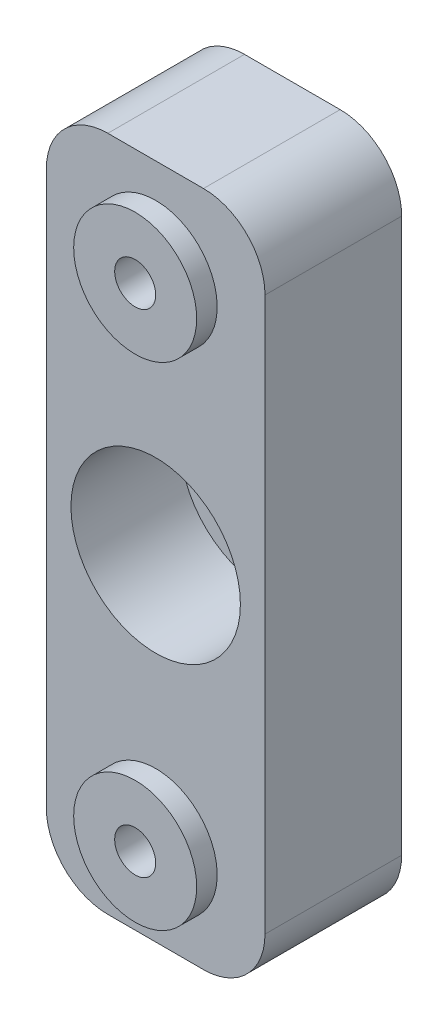
ISO-10303-21;
HEADER;
FILE_DESCRIPTION(('STEP AP214'),'2;1');
FILE_NAME('part.step','',(''),(''),'','','');
FILE_SCHEMA(('AUTOMOTIVE_DESIGN { 1 0 10303 214 1 1 1 1 }'));
ENDSEC;
DATA;
#1=APPLICATION_CONTEXT('core data for automotive mechanical design processes');
#2=APPLICATION_PROTOCOL_DEFINITION('international standard','automotive_design',2000,#1);
#3=PRODUCT_CONTEXT('',#1,'mechanical');
#4=PRODUCT('Part','Part','',(#3));
#5=PRODUCT_RELATED_PRODUCT_CATEGORY('part','',(#4));
#6=PRODUCT_DEFINITION_FORMATION('','',#4);
#7=PRODUCT_DEFINITION_CONTEXT('part definition',#1,'design');
#8=PRODUCT_DEFINITION('design','',#6,#7);
#9=PRODUCT_DEFINITION_SHAPE('','',#8);
#10=(LENGTH_UNIT() NAMED_UNIT(*) SI_UNIT(.MILLI.,.METRE.));
#11=(NAMED_UNIT(*) PLANE_ANGLE_UNIT() SI_UNIT($,.RADIAN.));
#12=(NAMED_UNIT(*) SI_UNIT($,.STERADIAN.) SOLID_ANGLE_UNIT());
#13=UNCERTAINTY_MEASURE_WITH_UNIT(LENGTH_MEASURE(1.E-05),#10,'distance_accuracy_value','');
#14=(GEOMETRIC_REPRESENTATION_CONTEXT(3) GLOBAL_UNCERTAINTY_ASSIGNED_CONTEXT((#13)) GLOBAL_UNIT_ASSIGNED_CONTEXT((#10,
#11,#12)) REPRESENTATION_CONTEXT('',''));
#15=CARTESIAN_POINT('',(0.,0.,0.));
#16=DIRECTION('',(0.,0.,1.));
#17=DIRECTION('',(1.,0.,0.));
#18=AXIS2_PLACEMENT_3D('',#15,#16,#17);
#19=CARTESIAN_POINT('',(11.5,10.,10.));
#20=DIRECTION('',(0.,0.,-1.));
#21=DIRECTION('',(-1.,0.,0.));
#22=AXIS2_PLACEMENT_3D('',#19,#20,#21);
#23=CYLINDRICAL_SURFACE('',#22,4.5);
#24=CARTESIAN_POINT('',(11.5,10.,0.));
#25=DIRECTION('',(0.,0.,-1.));
#26=DIRECTION('',(-1.,0.,0.));
#27=AXIS2_PLACEMENT_3D('',#24,#25,#26);
#28=CIRCLE('',#27,4.5);
#29=CARTESIAN_POINT('',(16.,10.,0.));
#30=VERTEX_POINT('',#29);
#31=CARTESIAN_POINT('',(11.5,5.5,0.));
#32=VERTEX_POINT('',#31);
#33=EDGE_CURVE('E264',#30,#32,#28,.T.);
#34=ORIENTED_EDGE('',*,*,#33,.F.);
#35=DIRECTION('',(0.,0.,-1.));
#36=VECTOR('',#35,1.);
#37=CARTESIAN_POINT('',(16.,10.,10.));
#38=LINE('',#37,#36);
#39=CARTESIAN_POINT('',(16.,10.,10.));
#40=VERTEX_POINT('',#39);
#41=EDGE_CURVE('E322',#40,#30,#38,.T.);
#42=ORIENTED_EDGE('',*,*,#41,.F.);
#43=CARTESIAN_POINT('',(11.5,10.,10.));
#44=DIRECTION('',(0.,0.,-1.));
#45=DIRECTION('',(-1.,0.,0.));
#46=AXIS2_PLACEMENT_3D('',#43,#44,#45);
#47=CIRCLE('',#46,4.5);
#48=CARTESIAN_POINT('',(11.5,5.5,10.));
#49=VERTEX_POINT('',#48);
#50=EDGE_CURVE('E274',#40,#49,#47,.T.);
#51=ORIENTED_EDGE('',*,*,#50,.T.);
#52=DIRECTION('',(0.,0.,-1.));
#53=VECTOR('',#52,1.);
#54=CARTESIAN_POINT('',(11.5,5.5,10.));
#55=LINE('',#54,#53);
#56=EDGE_CURVE('E299',#49,#32,#55,.T.);
#57=ORIENTED_EDGE('',*,*,#56,.T.);
#58=EDGE_LOOP('',(#34,#42,#51,#57));
#59=FACE_BOUND('',#58,.T.);
#60=ADVANCED_FACE('F34',(#59),#23,.T.);
#61=CARTESIAN_POINT('',(16.,50.5,10.));
#62=DIRECTION('',(1.,0.,0.));
#63=DIRECTION('',(0.,1.,0.));
#64=AXIS2_PLACEMENT_3D('',#61,#62,#63);
#65=PLANE('',#64);
#66=DIRECTION('',(0.,-1.,0.));
#67=VECTOR('',#66,1.);
#68=CARTESIAN_POINT('',(16.,50.5,0.));
#69=LINE('',#68,#67);
#70=CARTESIAN_POINT('',(16.,50.5,0.));
#71=VERTEX_POINT('',#70);
#72=EDGE_CURVE('E278',#71,#30,#69,.T.);
#73=ORIENTED_EDGE('',*,*,#72,.F.);
#74=DIRECTION('',(0.,0.,-1.));
#75=VECTOR('',#74,1.);
#76=CARTESIAN_POINT('',(16.,50.5,10.));
#77=LINE('',#76,#75);
#78=CARTESIAN_POINT('',(16.,50.5,10.));
#79=VERTEX_POINT('',#78);
#80=EDGE_CURVE('E324',#79,#71,#77,.T.);
#81=ORIENTED_EDGE('',*,*,#80,.F.);
#82=DIRECTION('',(0.,-1.,0.));
#83=VECTOR('',#82,1.);
#84=CARTESIAN_POINT('',(16.,50.5,10.));
#85=LINE('',#84,#83);
#86=EDGE_CURVE('E296',#79,#40,#85,.T.);
#87=ORIENTED_EDGE('',*,*,#86,.T.);
#88=ORIENTED_EDGE('',*,*,#41,.T.);
#89=EDGE_LOOP('',(#73,#81,#87,#88));
#90=FACE_BOUND('',#89,.T.);
#91=ADVANCED_FACE('F356',(#90),#65,.T.);
#92=CARTESIAN_POINT('',(11.5,50.5,10.));
#93=DIRECTION('',(0.,0.,-1.));
#94=DIRECTION('',(-1.,0.,0.));
#95=AXIS2_PLACEMENT_3D('',#92,#93,#94);
#96=CYLINDRICAL_SURFACE('',#95,4.5);
#97=CARTESIAN_POINT('',(11.5,50.5,0.));
#98=DIRECTION('',(0.,0.,-1.));
#99=DIRECTION('',(-1.,0.,0.));
#100=AXIS2_PLACEMENT_3D('',#97,#98,#99);
#101=CIRCLE('',#100,4.5);
#102=CARTESIAN_POINT('',(11.5,55.,0.));
#103=VERTEX_POINT('',#102);
#104=EDGE_CURVE('E317',#103,#71,#101,.T.);
#105=ORIENTED_EDGE('',*,*,#104,.F.);
#106=DIRECTION('',(0.,0.,-1.));
#107=VECTOR('',#106,1.);
#108=CARTESIAN_POINT('',(11.5,55.,10.));
#109=LINE('',#108,#107);
#110=CARTESIAN_POINT('',(11.5,55.,10.));
#111=VERTEX_POINT('',#110);
#112=EDGE_CURVE('E326',#111,#103,#109,.T.);
#113=ORIENTED_EDGE('',*,*,#112,.F.);
#114=CARTESIAN_POINT('',(11.5,50.5,10.));
#115=DIRECTION('',(0.,0.,-1.));
#116=DIRECTION('',(-1.,0.,0.));
#117=AXIS2_PLACEMENT_3D('',#114,#115,#116);
#118=CIRCLE('',#117,4.5);
#119=EDGE_CURVE('E293',#111,#79,#118,.T.);
#120=ORIENTED_EDGE('',*,*,#119,.T.);
#121=ORIENTED_EDGE('',*,*,#80,.T.);
#122=EDGE_LOOP('',(#105,#113,#120,#121));
#123=FACE_BOUND('',#122,.T.);
#124=ADVANCED_FACE('F360',(#123),#96,.T.);
#125=CARTESIAN_POINT('',(11.5,55.,10.));
#126=DIRECTION('',(0.,1.,0.));
#127=DIRECTION('',(0.,0.,1.));
#128=AXIS2_PLACEMENT_3D('',#125,#126,#127);
#129=PLANE('',#128);
#130=DIRECTION('',(1.,0.,0.));
#131=VECTOR('',#130,1.);
#132=CARTESIAN_POINT('',(11.5,55.,0.));
#133=LINE('',#132,#131);
#134=CARTESIAN_POINT('',(4.50000000000003,55.,0.));
#135=VERTEX_POINT('',#134);
#136=EDGE_CURVE('E314',#135,#103,#133,.T.);
#137=ORIENTED_EDGE('',*,*,#136,.F.);
#138=DIRECTION('',(0.,0.,-1.));
#139=VECTOR('',#138,1.);
#140=CARTESIAN_POINT('',(4.50000000000003,55.,10.));
#141=LINE('',#140,#139);
#142=CARTESIAN_POINT('',(4.50000000000003,55.,10.));
#143=VERTEX_POINT('',#142);
#144=EDGE_CURVE('E328',#143,#135,#141,.T.);
#145=ORIENTED_EDGE('',*,*,#144,.F.);
#146=DIRECTION('',(1.,0.,0.));
#147=VECTOR('',#146,1.);
#148=CARTESIAN_POINT('',(11.5,55.,10.));
#149=LINE('',#148,#147);
#150=EDGE_CURVE('E290',#143,#111,#149,.T.);
#151=ORIENTED_EDGE('',*,*,#150,.T.);
#152=ORIENTED_EDGE('',*,*,#112,.T.);
#153=EDGE_LOOP('',(#137,#145,#151,#152));
#154=FACE_BOUND('',#153,.T.);
#155=ADVANCED_FACE('F365',(#154),#129,.T.);
#156=CARTESIAN_POINT('',(4.5,50.5,10.));
#157=DIRECTION('',(0.,0.,-1.));
#158=DIRECTION('',(-1.,0.,0.));
#159=AXIS2_PLACEMENT_3D('',#156,#157,#158);
#160=CYLINDRICAL_SURFACE('',#159,4.5);
#161=CARTESIAN_POINT('',(4.5,50.5,0.));
#162=DIRECTION('',(0.,0.,-1.));
#163=DIRECTION('',(1.,0.,0.));
#164=AXIS2_PLACEMENT_3D('',#161,#162,#163);
#165=CIRCLE('',#164,4.5);
#166=CARTESIAN_POINT('',(0.,50.5,0.));
#167=VERTEX_POINT('',#166);
#168=EDGE_CURVE('E311',#167,#135,#165,.T.);
#169=ORIENTED_EDGE('',*,*,#168,.F.);
#170=DIRECTION('',(0.,0.,-1.));
#171=VECTOR('',#170,1.);
#172=CARTESIAN_POINT('',(0.,50.5,10.));
#173=LINE('',#172,#171);
#174=CARTESIAN_POINT('',(0.,50.5,10.));
#175=VERTEX_POINT('',#174);
#176=EDGE_CURVE('E330',#175,#167,#173,.T.);
#177=ORIENTED_EDGE('',*,*,#176,.F.);
#178=CARTESIAN_POINT('',(4.5,50.5,10.));
#179=DIRECTION('',(0.,0.,-1.));
#180=DIRECTION('',(1.,0.,0.));
#181=AXIS2_PLACEMENT_3D('',#178,#179,#180);
#182=CIRCLE('',#181,4.5);
#183=EDGE_CURVE('E287',#175,#143,#182,.T.);
#184=ORIENTED_EDGE('',*,*,#183,.T.);
#185=ORIENTED_EDGE('',*,*,#144,.T.);
#186=EDGE_LOOP('',(#169,#177,#184,#185));
#187=FACE_BOUND('',#186,.T.);
#188=ADVANCED_FACE('F368',(#187),#160,.T.);
#189=CARTESIAN_POINT('',(0.,50.5,10.));
#190=DIRECTION('',(-1.,0.,0.));
#191=DIRECTION('',(0.,-1.,0.));
#192=AXIS2_PLACEMENT_3D('',#189,#190,#191);
#193=PLANE('',#192);
#194=DIRECTION('',(0.,1.,0.));
#195=VECTOR('',#194,1.);
#196=CARTESIAN_POINT('',(0.,50.5,0.));
#197=LINE('',#196,#195);
#198=CARTESIAN_POINT('',(0.,10.,0.));
#199=VERTEX_POINT('',#198);
#200=EDGE_CURVE('E308',#199,#167,#197,.T.);
#201=ORIENTED_EDGE('',*,*,#200,.F.);
#202=DIRECTION('',(0.,0.,-1.));
#203=VECTOR('',#202,1.);
#204=CARTESIAN_POINT('',(0.,10.,10.));
#205=LINE('',#204,#203);
#206=CARTESIAN_POINT('',(0.,10.,10.));
#207=VERTEX_POINT('',#206);
#208=EDGE_CURVE('E332',#207,#199,#205,.T.);
#209=ORIENTED_EDGE('',*,*,#208,.F.);
#210=DIRECTION('',(0.,1.,0.));
#211=VECTOR('',#210,1.);
#212=CARTESIAN_POINT('',(0.,50.5,10.));
#213=LINE('',#212,#211);
#214=EDGE_CURVE('E284',#207,#175,#213,.T.);
#215=ORIENTED_EDGE('',*,*,#214,.T.);
#216=ORIENTED_EDGE('',*,*,#176,.T.);
#217=EDGE_LOOP('',(#201,#209,#215,#216));
#218=FACE_BOUND('',#217,.T.);
#219=ADVANCED_FACE('F372',(#218),#193,.T.);
#220=CARTESIAN_POINT('',(4.49999999999999,10.,10.));
#221=DIRECTION('',(0.,0.,-1.));
#222=DIRECTION('',(-1.,0.,0.));
#223=AXIS2_PLACEMENT_3D('',#220,#221,#222);
#224=CYLINDRICAL_SURFACE('',#223,4.5);
#225=CARTESIAN_POINT('',(4.49999999999999,10.,0.));
#226=DIRECTION('',(0.,0.,-1.));
#227=DIRECTION('',(-1.,0.,0.));
#228=AXIS2_PLACEMENT_3D('',#225,#226,#227);
#229=CIRCLE('',#228,4.5);
#230=CARTESIAN_POINT('',(4.50000000000003,5.5,0.));
#231=VERTEX_POINT('',#230);
#232=EDGE_CURVE('E305',#231,#199,#229,.T.);
#233=ORIENTED_EDGE('',*,*,#232,.F.);
#234=DIRECTION('',(0.,0.,-1.));
#235=VECTOR('',#234,1.);
#236=CARTESIAN_POINT('',(4.50000000000003,5.5,10.));
#237=LINE('',#236,#235);
#238=CARTESIAN_POINT('',(4.50000000000003,5.5,10.));
#239=VERTEX_POINT('',#238);
#240=EDGE_CURVE('E334',#239,#231,#237,.T.);
#241=ORIENTED_EDGE('',*,*,#240,.F.);
#242=CARTESIAN_POINT('',(4.49999999999999,10.,10.));
#243=DIRECTION('',(0.,0.,-1.));
#244=DIRECTION('',(-1.,0.,0.));
#245=AXIS2_PLACEMENT_3D('',#242,#243,#244);
#246=CIRCLE('',#245,4.5);
#247=EDGE_CURVE('E281',#239,#207,#246,.T.);
#248=ORIENTED_EDGE('',*,*,#247,.T.);
#249=ORIENTED_EDGE('',*,*,#208,.T.);
#250=EDGE_LOOP('',(#233,#241,#248,#249));
#251=FACE_BOUND('',#250,.T.);
#252=ADVANCED_FACE('F375',(#251),#224,.T.);
#253=CARTESIAN_POINT('',(11.5,5.5,10.));
#254=DIRECTION('',(0.,-1.,0.));
#255=DIRECTION('',(0.,0.,-1.));
#256=AXIS2_PLACEMENT_3D('',#253,#254,#255);
#257=PLANE('',#256);
#258=DIRECTION('',(-1.,0.,0.));
#259=VECTOR('',#258,1.);
#260=CARTESIAN_POINT('',(11.5,5.5,0.));
#261=LINE('',#260,#259);
#262=EDGE_CURVE('E302',#32,#231,#261,.T.);
#263=ORIENTED_EDGE('',*,*,#262,.F.);
#264=ORIENTED_EDGE('',*,*,#56,.F.);
#265=DIRECTION('',(-1.,0.,0.));
#266=VECTOR('',#265,1.);
#267=CARTESIAN_POINT('',(11.5,5.5,10.));
#268=LINE('',#267,#266);
#269=EDGE_CURVE('E277',#49,#239,#268,.T.);
#270=ORIENTED_EDGE('',*,*,#269,.T.);
#271=ORIENTED_EDGE('',*,*,#240,.T.);
#272=EDGE_LOOP('',(#263,#264,#270,#271));
#273=FACE_BOUND('',#272,.T.);
#274=ADVANCED_FACE('F345',(#273),#257,.T.);
#275=CARTESIAN_POINT('',(11.5,10.,10.));
#276=DIRECTION('',(0.,0.,-1.));
#277=DIRECTION('',(-1.,0.,0.));
#278=AXIS2_PLACEMENT_3D('',#275,#276,#277);
#279=PLANE('',#278);
#280=CARTESIAN_POINT('',(8.00000000000001,30.,10.));
#281=DIRECTION('',(0.,0.,1.));
#282=DIRECTION('',(1.,0.,0.));
#283=AXIS2_PLACEMENT_3D('',#280,#281,#282);
#284=CIRCLE('',#283,6.2);
#285=CARTESIAN_POINT('',(14.2,30.,10.));
#286=VERTEX_POINT('',#285);
#287=EDGE_CURVE('E671',#286,#286,#284,.T.);
#288=ORIENTED_EDGE('',*,*,#287,.F.);
#289=EDGE_LOOP('',(#288));
#290=FACE_BOUND('',#289,.T.);
#291=CARTESIAN_POINT('',(8.,12.,10.));
#292=DIRECTION('',(0.,0.,-1.));
#293=DIRECTION('',(-1.,0.,0.));
#294=AXIS2_PLACEMENT_3D('',#291,#292,#293);
#295=CIRCLE('',#294,4.5);
#296=CARTESIAN_POINT('',(3.5,12.,10.));
#297=VERTEX_POINT('',#296);
#298=EDGE_CURVE('E11',#297,#297,#295,.F.);
#299=ORIENTED_EDGE('',*,*,#298,.F.);
#300=EDGE_LOOP('',(#299));
#301=FACE_BOUND('',#300,.T.);
#302=CARTESIAN_POINT('',(8.,48.,10.));
#303=DIRECTION('',(0.,0.,-1.));
#304=DIRECTION('',(-1.,0.,0.));
#305=AXIS2_PLACEMENT_3D('',#302,#303,#304);
#306=CIRCLE('',#305,4.5);
#307=CARTESIAN_POINT('',(3.5,48.,10.));
#308=VERTEX_POINT('',#307);
#309=EDGE_CURVE('E41',#308,#308,#306,.F.);
#310=ORIENTED_EDGE('',*,*,#309,.F.);
#311=EDGE_LOOP('',(#310));
#312=FACE_BOUND('',#311,.T.);
#313=ORIENTED_EDGE('',*,*,#50,.F.);
#314=ORIENTED_EDGE('',*,*,#86,.F.);
#315=ORIENTED_EDGE('',*,*,#119,.F.);
#316=ORIENTED_EDGE('',*,*,#150,.F.);
#317=ORIENTED_EDGE('',*,*,#183,.F.);
#318=ORIENTED_EDGE('',*,*,#214,.F.);
#319=ORIENTED_EDGE('',*,*,#247,.F.);
#320=ORIENTED_EDGE('',*,*,#269,.F.);
#321=EDGE_LOOP('',(#313,#314,#315,#316,#317,#318,#319,#320));
#322=FACE_BOUND('',#321,.T.);
#323=ADVANCED_FACE('F341',(#290,#301,#312,#322),#279,.F.);
#324=CARTESIAN_POINT('',(11.5,10.,0.));
#325=DIRECTION('',(0.,0.,-1.));
#326=DIRECTION('',(-1.,0.,0.));
#327=AXIS2_PLACEMENT_3D('',#324,#325,#326);
#328=PLANE('',#327);
#329=DIRECTION('',(0.866025403784439,0.499999999999999,0.));
#330=VECTOR('',#329,1.);
#331=CARTESIAN_POINT('',(4.96891108675447,13.75,0.));
#332=LINE('',#331,#330);
#333=CARTESIAN_POINT('',(4.96891108675447,13.75,0.));
#334=VERTEX_POINT('',#333);
#335=CARTESIAN_POINT('',(8.,15.5,0.));
#336=VERTEX_POINT('',#335);
#337=EDGE_CURVE('E48',#334,#336,#332,.T.);
#338=ORIENTED_EDGE('',*,*,#337,.F.);
#339=DIRECTION('',(0.,1.,0.));
#340=VECTOR('',#339,1.);
#341=CARTESIAN_POINT('',(4.96891108675446,10.25,0.));
#342=LINE('',#341,#340);
#343=CARTESIAN_POINT('',(4.96891108675446,10.25,0.));
#344=VERTEX_POINT('',#343);
#345=EDGE_CURVE('E191',#344,#334,#342,.T.);
#346=ORIENTED_EDGE('',*,*,#345,.F.);
#347=DIRECTION('',(-0.866025403784437,0.500000000000003,0.));
#348=VECTOR('',#347,1.);
#349=CARTESIAN_POINT('',(7.99999999999999,8.49999999999999,0.));
#350=LINE('',#349,#348);
#351=CARTESIAN_POINT('',(7.99999999999999,8.49999999999999,0.));
#352=VERTEX_POINT('',#351);
#353=EDGE_CURVE('E194',#352,#344,#350,.T.);
#354=ORIENTED_EDGE('',*,*,#353,.F.);
#355=DIRECTION('',(-0.866025403784439,-0.5,0.));
#356=VECTOR('',#355,1.);
#357=CARTESIAN_POINT('',(11.0310889132455,10.25,0.));
#358=LINE('',#357,#356);
#359=CARTESIAN_POINT('',(11.0310889132455,10.25,0.));
#360=VERTEX_POINT('',#359);
#361=EDGE_CURVE('E213',#360,#352,#358,.T.);
#362=ORIENTED_EDGE('',*,*,#361,.F.);
#363=DIRECTION('',(0.,-1.,0.));
#364=VECTOR('',#363,1.);
#365=CARTESIAN_POINT('',(11.0310889132455,13.75,0.));
#366=LINE('',#365,#364);
#367=CARTESIAN_POINT('',(11.0310889132455,13.75,0.));
#368=VERTEX_POINT('',#367);
#369=EDGE_CURVE('E210',#368,#360,#366,.T.);
#370=ORIENTED_EDGE('',*,*,#369,.F.);
#371=DIRECTION('',(0.866025403784437,-0.500000000000002,0.));
#372=VECTOR('',#371,1.);
#373=CARTESIAN_POINT('',(8.,15.5,0.));
#374=LINE('',#373,#372);
#375=EDGE_CURVE('E208',#336,#368,#374,.T.);
#376=ORIENTED_EDGE('',*,*,#375,.F.);
#377=EDGE_LOOP('',(#338,#346,#354,#362,#370,#376));
#378=FACE_BOUND('',#377,.T.);
#379=DIRECTION('',(0.866025403784439,0.5,0.));
#380=VECTOR('',#379,1.);
#381=CARTESIAN_POINT('',(4.96891108675447,49.75,0.));
#382=LINE('',#381,#380);
#383=CARTESIAN_POINT('',(4.96891108675447,49.75,0.));
#384=VERTEX_POINT('',#383);
#385=CARTESIAN_POINT('',(8.,51.5,0.));
#386=VERTEX_POINT('',#385);
#387=EDGE_CURVE('E56',#384,#386,#382,.T.);
#388=ORIENTED_EDGE('',*,*,#387,.F.);
#389=DIRECTION('',(0.,1.,0.));
#390=VECTOR('',#389,1.);
#391=CARTESIAN_POINT('',(4.96891108675446,46.25,0.));
#392=LINE('',#391,#390);
#393=CARTESIAN_POINT('',(4.96891108675446,46.25,0.));
#394=VERTEX_POINT('',#393);
#395=EDGE_CURVE('E231',#394,#384,#392,.T.);
#396=ORIENTED_EDGE('',*,*,#395,.F.);
#397=DIRECTION('',(-0.866025403784437,0.500000000000002,0.));
#398=VECTOR('',#397,1.);
#399=CARTESIAN_POINT('',(7.99999999999999,44.5,0.));
#400=LINE('',#399,#398);
#401=CARTESIAN_POINT('',(7.99999999999999,44.5,0.));
#402=VERTEX_POINT('',#401);
#403=EDGE_CURVE('E257',#402,#394,#400,.T.);
#404=ORIENTED_EDGE('',*,*,#403,.F.);
#405=DIRECTION('',(-0.866025403784439,-0.5,0.));
#406=VECTOR('',#405,1.);
#407=CARTESIAN_POINT('',(11.0310889132455,46.25,0.));
#408=LINE('',#407,#406);
#409=CARTESIAN_POINT('',(11.0310889132455,46.25,0.));
#410=VERTEX_POINT('',#409);
#411=EDGE_CURVE('E254',#410,#402,#408,.T.);
#412=ORIENTED_EDGE('',*,*,#411,.F.);
#413=DIRECTION('',(0.,-1.,0.));
#414=VECTOR('',#413,1.);
#415=CARTESIAN_POINT('',(11.0310889132455,49.75,0.));
#416=LINE('',#415,#414);
#417=CARTESIAN_POINT('',(11.0310889132455,49.75,0.));
#418=VERTEX_POINT('',#417);
#419=EDGE_CURVE('E251',#418,#410,#416,.T.);
#420=ORIENTED_EDGE('',*,*,#419,.F.);
#421=DIRECTION('',(0.866025403784437,-0.500000000000002,0.));
#422=VECTOR('',#421,1.);
#423=CARTESIAN_POINT('',(8.00000000000001,51.5,0.));
#424=LINE('',#423,#422);
#425=EDGE_CURVE('E248',#386,#418,#424,.T.);
#426=ORIENTED_EDGE('',*,*,#425,.F.);
#427=EDGE_LOOP('',(#388,#396,#404,#412,#420,#426));
#428=FACE_BOUND('',#427,.T.);
#429=ORIENTED_EDGE('',*,*,#33,.T.);
#430=ORIENTED_EDGE('',*,*,#262,.T.);
#431=ORIENTED_EDGE('',*,*,#232,.T.);
#432=ORIENTED_EDGE('',*,*,#200,.T.);
#433=ORIENTED_EDGE('',*,*,#168,.T.);
#434=ORIENTED_EDGE('',*,*,#136,.T.);
#435=ORIENTED_EDGE('',*,*,#104,.T.);
#436=ORIENTED_EDGE('',*,*,#72,.T.);
#437=EDGE_LOOP('',(#429,#430,#431,#432,#433,#434,#435,#436));
#438=FACE_BOUND('',#437,.T.);
#439=ADVANCED_FACE('F344',(#378,#428,#438),#328,.T.);
#440=CARTESIAN_POINT('',(4.96891108675447,49.75,2.5));
#441=DIRECTION('',(-0.5,0.866025403784439,0.));
#442=DIRECTION('',(-0.866025403784439,-0.5,0.));
#443=AXIS2_PLACEMENT_3D('',#440,#441,#442);
#444=PLANE('',#443);
#445=ORIENTED_EDGE('',*,*,#387,.T.);
#446=DIRECTION('',(0.,0.,-1.));
#447=VECTOR('',#446,1.);
#448=CARTESIAN_POINT('',(8.00000000000001,51.5,2.5));
#449=LINE('',#448,#447);
#450=CARTESIAN_POINT('',(8.00000000000001,51.5,2.5));
#451=VERTEX_POINT('',#450);
#452=EDGE_CURVE('E246',#451,#386,#449,.T.);
#453=ORIENTED_EDGE('',*,*,#452,.F.);
#454=DIRECTION('',(0.866025403784439,0.5,0.));
#455=VECTOR('',#454,1.);
#456=CARTESIAN_POINT('',(4.96891108675447,49.75,2.5));
#457=LINE('',#456,#455);
#458=CARTESIAN_POINT('',(4.96891108675447,49.75,2.5));
#459=VERTEX_POINT('',#458);
#460=EDGE_CURVE('E227',#459,#451,#457,.T.);
#461=ORIENTED_EDGE('',*,*,#460,.F.);
#462=DIRECTION('',(0.,0.,-1.));
#463=VECTOR('',#462,1.);
#464=CARTESIAN_POINT('',(4.96891108675447,49.75,2.5));
#465=LINE('',#464,#463);
#466=EDGE_CURVE('E262',#459,#384,#465,.T.);
#467=ORIENTED_EDGE('',*,*,#466,.T.);
#468=EDGE_LOOP('',(#445,#453,#461,#467));
#469=FACE_BOUND('',#468,.T.);
#470=ADVANCED_FACE('F380',(#469),#444,.F.);
#471=CARTESIAN_POINT('',(4.96891108675446,46.25,2.5));
#472=DIRECTION('',(-1.,0.,0.));
#473=DIRECTION('',(0.,-1.,0.));
#474=AXIS2_PLACEMENT_3D('',#471,#472,#473);
#475=PLANE('',#474);
#476=ORIENTED_EDGE('',*,*,#395,.T.);
#477=ORIENTED_EDGE('',*,*,#466,.F.);
#478=DIRECTION('',(0.,1.,0.));
#479=VECTOR('',#478,1.);
#480=CARTESIAN_POINT('',(4.96891108675446,46.25,2.5));
#481=LINE('',#480,#479);
#482=CARTESIAN_POINT('',(4.96891108675446,46.25,2.5));
#483=VERTEX_POINT('',#482);
#484=EDGE_CURVE('E243',#483,#459,#481,.T.);
#485=ORIENTED_EDGE('',*,*,#484,.F.);
#486=DIRECTION('',(0.,0.,-1.));
#487=VECTOR('',#486,1.);
#488=CARTESIAN_POINT('',(4.96891108675446,46.25,2.5));
#489=LINE('',#488,#487);
#490=EDGE_CURVE('E265',#483,#394,#489,.T.);
#491=ORIENTED_EDGE('',*,*,#490,.T.);
#492=EDGE_LOOP('',(#476,#477,#485,#491));
#493=FACE_BOUND('',#492,.T.);
#494=ADVANCED_FACE('F386',(#493),#475,.F.);
#495=CARTESIAN_POINT('',(7.99999999999999,44.5,2.5));
#496=DIRECTION('',(-0.500000000000002,-0.866025403784437,0.));
#497=DIRECTION('',(0.866025403784437,-0.500000000000002,0.));
#498=AXIS2_PLACEMENT_3D('',#495,#496,#497);
#499=PLANE('',#498);
#500=ORIENTED_EDGE('',*,*,#403,.T.);
#501=ORIENTED_EDGE('',*,*,#490,.F.);
#502=DIRECTION('',(-0.866025403784437,0.500000000000002,0.));
#503=VECTOR('',#502,1.);
#504=CARTESIAN_POINT('',(7.99999999999999,44.5,2.5));
#505=LINE('',#504,#503);
#506=CARTESIAN_POINT('',(7.99999999999999,44.5,2.5));
#507=VERTEX_POINT('',#506);
#508=EDGE_CURVE('E240',#507,#483,#505,.T.);
#509=ORIENTED_EDGE('',*,*,#508,.F.);
#510=DIRECTION('',(0.,0.,-1.));
#511=VECTOR('',#510,1.);
#512=CARTESIAN_POINT('',(7.99999999999999,44.5,2.5));
#513=LINE('',#512,#511);
#514=EDGE_CURVE('E267',#507,#402,#513,.T.);
#515=ORIENTED_EDGE('',*,*,#514,.T.);
#516=EDGE_LOOP('',(#500,#501,#509,#515));
#517=FACE_BOUND('',#516,.T.);
#518=ADVANCED_FACE('F499',(#517),#499,.F.);
#519=CARTESIAN_POINT('',(11.0310889132455,46.25,2.5));
#520=DIRECTION('',(0.5,-0.866025403784439,0.));
#521=DIRECTION('',(0.866025403784439,0.5,0.));
#522=AXIS2_PLACEMENT_3D('',#519,#520,#521);
#523=PLANE('',#522);
#524=ORIENTED_EDGE('',*,*,#411,.T.);
#525=ORIENTED_EDGE('',*,*,#514,.F.);
#526=DIRECTION('',(-0.866025403784439,-0.5,0.));
#527=VECTOR('',#526,1.);
#528=CARTESIAN_POINT('',(11.0310889132455,46.25,2.5));
#529=LINE('',#528,#527);
#530=CARTESIAN_POINT('',(11.0310889132455,46.25,2.5));
#531=VERTEX_POINT('',#530);
#532=EDGE_CURVE('E237',#531,#507,#529,.T.);
#533=ORIENTED_EDGE('',*,*,#532,.F.);
#534=DIRECTION('',(0.,0.,-1.));
#535=VECTOR('',#534,1.);
#536=CARTESIAN_POINT('',(11.0310889132455,46.25,2.5));
#537=LINE('',#536,#535);
#538=EDGE_CURVE('E269',#531,#410,#537,.T.);
#539=ORIENTED_EDGE('',*,*,#538,.T.);
#540=EDGE_LOOP('',(#524,#525,#533,#539));
#541=FACE_BOUND('',#540,.T.);
#542=ADVANCED_FACE('F503',(#541),#523,.F.);
#543=CARTESIAN_POINT('',(11.0310889132455,49.75,2.5));
#544=DIRECTION('',(1.,0.,0.));
#545=DIRECTION('',(0.,1.,0.));
#546=AXIS2_PLACEMENT_3D('',#543,#544,#545);
#547=PLANE('',#546);
#548=ORIENTED_EDGE('',*,*,#419,.T.);
#549=ORIENTED_EDGE('',*,*,#538,.F.);
#550=DIRECTION('',(0.,-1.,0.));
#551=VECTOR('',#550,1.);
#552=CARTESIAN_POINT('',(11.0310889132455,49.75,2.5));
#553=LINE('',#552,#551);
#554=CARTESIAN_POINT('',(11.0310889132455,49.75,2.5));
#555=VERTEX_POINT('',#554);
#556=EDGE_CURVE('E234',#555,#531,#553,.T.);
#557=ORIENTED_EDGE('',*,*,#556,.F.);
#558=DIRECTION('',(0.,0.,-1.));
#559=VECTOR('',#558,1.);
#560=CARTESIAN_POINT('',(11.0310889132455,49.75,2.5));
#561=LINE('',#560,#559);
#562=EDGE_CURVE('E271',#555,#418,#561,.T.);
#563=ORIENTED_EDGE('',*,*,#562,.T.);
#564=EDGE_LOOP('',(#548,#549,#557,#563));
#565=FACE_BOUND('',#564,.T.);
#566=ADVANCED_FACE('F507',(#565),#547,.F.);
#567=CARTESIAN_POINT('',(8.00000000000001,51.5,2.5));
#568=DIRECTION('',(0.500000000000002,0.866025403784437,0.));
#569=DIRECTION('',(-0.866025403784437,0.500000000000002,0.));
#570=AXIS2_PLACEMENT_3D('',#567,#568,#569);
#571=PLANE('',#570);
#572=ORIENTED_EDGE('',*,*,#425,.T.);
#573=ORIENTED_EDGE('',*,*,#562,.F.);
#574=DIRECTION('',(0.866025403784437,-0.500000000000002,0.));
#575=VECTOR('',#574,1.);
#576=CARTESIAN_POINT('',(8.00000000000001,51.5,2.5));
#577=LINE('',#576,#575);
#578=EDGE_CURVE('E230',#451,#555,#577,.T.);
#579=ORIENTED_EDGE('',*,*,#578,.F.);
#580=ORIENTED_EDGE('',*,*,#452,.T.);
#581=EDGE_LOOP('',(#572,#573,#579,#580));
#582=FACE_BOUND('',#581,.T.);
#583=ADVANCED_FACE('F495',(#582),#571,.F.);
#584=CARTESIAN_POINT('',(0.,0.,2.5));
#585=DIRECTION('',(0.,0.,-1.));
#586=DIRECTION('',(-1.,0.,0.));
#587=AXIS2_PLACEMENT_3D('',#584,#585,#586);
#588=PLANE('',#587);
#589=CARTESIAN_POINT('',(8.,48.,2.5));
#590=DIRECTION('',(0.,0.,-1.));
#591=DIRECTION('',(-1.,0.,0.));
#592=AXIS2_PLACEMENT_3D('',#589,#590,#591);
#593=CIRCLE('',#592,1.5);
#594=CARTESIAN_POINT('',(6.5,48.,2.5));
#595=VERTEX_POINT('',#594);
#596=EDGE_CURVE('E647',#595,#595,#593,.T.);
#597=ORIENTED_EDGE('',*,*,#596,.F.);
#598=EDGE_LOOP('',(#597));
#599=FACE_BOUND('',#598,.T.);
#600=ORIENTED_EDGE('',*,*,#460,.T.);
#601=ORIENTED_EDGE('',*,*,#578,.T.);
#602=ORIENTED_EDGE('',*,*,#556,.T.);
#603=ORIENTED_EDGE('',*,*,#532,.T.);
#604=ORIENTED_EDGE('',*,*,#508,.T.);
#605=ORIENTED_EDGE('',*,*,#484,.T.);
#606=EDGE_LOOP('',(#600,#601,#602,#603,#604,#605));
#607=FACE_BOUND('',#606,.T.);
#608=ADVANCED_FACE('F492',(#599,#607),#588,.T.);
#609=CARTESIAN_POINT('',(4.96891108675447,13.75,2.5));
#610=DIRECTION('',(-0.499999999999999,0.866025403784439,0.));
#611=DIRECTION('',(-0.866025403784439,-0.499999999999999,0.));
#612=AXIS2_PLACEMENT_3D('',#609,#610,#611);
#613=PLANE('',#612);
#614=ORIENTED_EDGE('',*,*,#337,.T.);
#615=DIRECTION('',(0.,0.,-1.));
#616=VECTOR('',#615,1.);
#617=CARTESIAN_POINT('',(8.,15.5,2.5));
#618=LINE('',#617,#616);
#619=CARTESIAN_POINT('',(8.,15.5,2.5));
#620=VERTEX_POINT('',#619);
#621=EDGE_CURVE('E168',#620,#336,#618,.T.);
#622=ORIENTED_EDGE('',*,*,#621,.F.);
#623=DIRECTION('',(0.866025403784439,0.499999999999999,0.));
#624=VECTOR('',#623,1.);
#625=CARTESIAN_POINT('',(4.96891108675447,13.75,2.5));
#626=LINE('',#625,#624);
#627=CARTESIAN_POINT('',(4.96891108675447,13.75,2.5));
#628=VERTEX_POINT('',#627);
#629=EDGE_CURVE('E172',#628,#620,#626,.T.);
#630=ORIENTED_EDGE('',*,*,#629,.F.);
#631=DIRECTION('',(0.,0.,-1.));
#632=VECTOR('',#631,1.);
#633=CARTESIAN_POINT('',(4.96891108675447,13.75,2.5));
#634=LINE('',#633,#632);
#635=EDGE_CURVE('E218',#628,#334,#634,.T.);
#636=ORIENTED_EDGE('',*,*,#635,.T.);
#637=EDGE_LOOP('',(#614,#622,#630,#636));
#638=FACE_BOUND('',#637,.T.);
#639=ADVANCED_FACE('F170',(#638),#613,.F.);
#640=CARTESIAN_POINT('',(4.96891108675446,10.25,2.5));
#641=DIRECTION('',(-1.,0.,0.));
#642=DIRECTION('',(0.,-1.,0.));
#643=AXIS2_PLACEMENT_3D('',#640,#641,#642);
#644=PLANE('',#643);
#645=ORIENTED_EDGE('',*,*,#345,.T.);
#646=ORIENTED_EDGE('',*,*,#635,.F.);
#647=DIRECTION('',(0.,1.,0.));
#648=VECTOR('',#647,1.);
#649=CARTESIAN_POINT('',(4.96891108675446,10.25,2.5));
#650=LINE('',#649,#648);
#651=CARTESIAN_POINT('',(4.96891108675446,10.25,2.5));
#652=VERTEX_POINT('',#651);
#653=EDGE_CURVE('E178',#652,#628,#650,.T.);
#654=ORIENTED_EDGE('',*,*,#653,.F.);
#655=DIRECTION('',(0.,0.,-1.));
#656=VECTOR('',#655,1.);
#657=CARTESIAN_POINT('',(4.96891108675446,10.25,2.5));
#658=LINE('',#657,#656);
#659=EDGE_CURVE('E220',#652,#344,#658,.T.);
#660=ORIENTED_EDGE('',*,*,#659,.T.);
#661=EDGE_LOOP('',(#645,#646,#654,#660));
#662=FACE_BOUND('',#661,.T.);
#663=ADVANCED_FACE('F472',(#662),#644,.F.);
#664=CARTESIAN_POINT('',(7.99999999999999,8.49999999999999,2.5));
#665=DIRECTION('',(-0.500000000000003,-0.866025403784437,0.));
#666=DIRECTION('',(0.866025403784437,-0.500000000000003,0.));
#667=AXIS2_PLACEMENT_3D('',#664,#665,#666);
#668=PLANE('',#667);
#669=ORIENTED_EDGE('',*,*,#353,.T.);
#670=ORIENTED_EDGE('',*,*,#659,.F.);
#671=DIRECTION('',(-0.866025403784437,0.500000000000003,0.));
#672=VECTOR('',#671,1.);
#673=CARTESIAN_POINT('',(7.99999999999999,8.49999999999999,2.5));
#674=LINE('',#673,#672);
#675=CARTESIAN_POINT('',(7.99999999999999,8.49999999999999,2.5));
#676=VERTEX_POINT('',#675);
#677=EDGE_CURVE('E204',#676,#652,#674,.T.);
#678=ORIENTED_EDGE('',*,*,#677,.F.);
#679=DIRECTION('',(0.,0.,-1.));
#680=VECTOR('',#679,1.);
#681=CARTESIAN_POINT('',(7.99999999999999,8.49999999999999,2.5));
#682=LINE('',#681,#680);
#683=EDGE_CURVE('E222',#676,#352,#682,.T.);
#684=ORIENTED_EDGE('',*,*,#683,.T.);
#685=EDGE_LOOP('',(#669,#670,#678,#684));
#686=FACE_BOUND('',#685,.T.);
#687=ADVANCED_FACE('F475',(#686),#668,.F.);
#688=CARTESIAN_POINT('',(11.0310889132455,10.25,2.5));
#689=DIRECTION('',(0.5,-0.866025403784439,0.));
#690=DIRECTION('',(0.866025403784439,0.5,0.));
#691=AXIS2_PLACEMENT_3D('',#688,#689,#690);
#692=PLANE('',#691);
#693=ORIENTED_EDGE('',*,*,#361,.T.);
#694=ORIENTED_EDGE('',*,*,#683,.F.);
#695=DIRECTION('',(-0.866025403784439,-0.5,0.));
#696=VECTOR('',#695,1.);
#697=CARTESIAN_POINT('',(11.0310889132455,10.25,2.5));
#698=LINE('',#697,#696);
#699=CARTESIAN_POINT('',(11.0310889132455,10.25,2.5));
#700=VERTEX_POINT('',#699);
#701=EDGE_CURVE('E201',#700,#676,#698,.T.);
#702=ORIENTED_EDGE('',*,*,#701,.F.);
#703=DIRECTION('',(0.,0.,-1.));
#704=VECTOR('',#703,1.);
#705=CARTESIAN_POINT('',(11.0310889132455,10.25,2.5));
#706=LINE('',#705,#704);
#707=EDGE_CURVE('E224',#700,#360,#706,.T.);
#708=ORIENTED_EDGE('',*,*,#707,.T.);
#709=EDGE_LOOP('',(#693,#694,#702,#708));
#710=FACE_BOUND('',#709,.T.);
#711=ADVANCED_FACE('F479',(#710),#692,.F.);
#712=CARTESIAN_POINT('',(11.0310889132455,13.75,2.5));
#713=DIRECTION('',(1.,0.,0.));
#714=DIRECTION('',(0.,0.,-1.));
#715=AXIS2_PLACEMENT_3D('',#712,#713,#714);
#716=PLANE('',#715);
#717=ORIENTED_EDGE('',*,*,#369,.T.);
#718=ORIENTED_EDGE('',*,*,#707,.F.);
#719=DIRECTION('',(0.,-1.,0.));
#720=VECTOR('',#719,1.);
#721=CARTESIAN_POINT('',(11.0310889132455,13.75,2.5));
#722=LINE('',#721,#720);
#723=CARTESIAN_POINT('',(11.0310889132455,13.75,2.5));
#724=VERTEX_POINT('',#723);
#725=EDGE_CURVE('E186',#724,#700,#722,.T.);
#726=ORIENTED_EDGE('',*,*,#725,.F.);
#727=DIRECTION('',(0.,0.,-1.));
#728=VECTOR('',#727,1.);
#729=CARTESIAN_POINT('',(11.0310889132455,13.75,2.5));
#730=LINE('',#729,#728);
#731=EDGE_CURVE('E177',#724,#368,#730,.T.);
#732=ORIENTED_EDGE('',*,*,#731,.T.);
#733=EDGE_LOOP('',(#717,#718,#726,#732));
#734=FACE_BOUND('',#733,.T.);
#735=ADVANCED_FACE('F483',(#734),#716,.F.);
#736=CARTESIAN_POINT('',(8.,15.5,2.5));
#737=DIRECTION('',(0.500000000000002,0.866025403784437,0.));
#738=DIRECTION('',(-0.866025403784437,0.500000000000002,0.));
#739=AXIS2_PLACEMENT_3D('',#736,#737,#738);
#740=PLANE('',#739);
#741=ORIENTED_EDGE('',*,*,#375,.T.);
#742=ORIENTED_EDGE('',*,*,#731,.F.);
#743=DIRECTION('',(0.866025403784437,-0.500000000000002,0.));
#744=VECTOR('',#743,1.);
#745=CARTESIAN_POINT('',(8.,15.5,2.5));
#746=LINE('',#745,#744);
#747=EDGE_CURVE('E181',#620,#724,#746,.T.);
#748=ORIENTED_EDGE('',*,*,#747,.F.);
#749=ORIENTED_EDGE('',*,*,#621,.T.);
#750=EDGE_LOOP('',(#741,#742,#748,#749));
#751=FACE_BOUND('',#750,.T.);
#752=ADVANCED_FACE('F182',(#751),#740,.F.);
#753=CARTESIAN_POINT('',(0.,0.,2.5));
#754=DIRECTION('',(0.,0.,-1.));
#755=DIRECTION('',(-1.,0.,0.));
#756=AXIS2_PLACEMENT_3D('',#753,#754,#755);
#757=PLANE('',#756);
#758=CARTESIAN_POINT('',(8.,12.,2.5));
#759=DIRECTION('',(0.,0.,-1.));
#760=DIRECTION('',(-1.,0.,0.));
#761=AXIS2_PLACEMENT_3D('',#758,#759,#760);
#762=CIRCLE('',#761,1.5);
#763=CARTESIAN_POINT('',(6.5,12.,2.5));
#764=VERTEX_POINT('',#763);
#765=EDGE_CURVE('E656',#764,#764,#762,.T.);
#766=ORIENTED_EDGE('',*,*,#765,.F.);
#767=EDGE_LOOP('',(#766));
#768=FACE_BOUND('',#767,.T.);
#769=ORIENTED_EDGE('',*,*,#629,.T.);
#770=ORIENTED_EDGE('',*,*,#747,.T.);
#771=ORIENTED_EDGE('',*,*,#725,.T.);
#772=ORIENTED_EDGE('',*,*,#701,.T.);
#773=ORIENTED_EDGE('',*,*,#677,.T.);
#774=ORIENTED_EDGE('',*,*,#653,.T.);
#775=EDGE_LOOP('',(#769,#770,#771,#772,#773,#774));
#776=FACE_BOUND('',#775,.T.);
#777=ADVANCED_FACE('F188',(#768,#776),#757,.T.);
#778=CARTESIAN_POINT('',(8.,48.,11.5));
#779=DIRECTION('',(0.,0.,-1.));
#780=DIRECTION('',(-1.,0.,0.));
#781=AXIS2_PLACEMENT_3D('',#778,#779,#780);
#782=CYLINDRICAL_SURFACE('',#781,4.5);
#783=CARTESIAN_POINT('',(8.,48.,11.5));
#784=DIRECTION('',(0.,0.,1.));
#785=DIRECTION('',(1.,0.,0.));
#786=AXIS2_PLACEMENT_3D('',#783,#784,#785);
#787=CIRCLE('',#786,4.5);
#788=CARTESIAN_POINT('',(12.5,48.,11.5));
#789=VERTEX_POINT('',#788);
#790=EDGE_CURVE('E197',#789,#789,#787,.T.);
#791=ORIENTED_EDGE('',*,*,#790,.F.);
#792=EDGE_LOOP('',(#791));
#793=FACE_BOUND('',#792,.T.);
#794=ORIENTED_EDGE('',*,*,#309,.T.);
#795=EDGE_LOOP('',(#794));
#796=FACE_BOUND('',#795,.T.);
#797=ADVANCED_FACE('F339',(#793,#796),#782,.T.);
#798=CARTESIAN_POINT('',(8.,48.,11.5));
#799=DIRECTION('',(0.,0.,1.));
#800=DIRECTION('',(1.,0.,0.));
#801=AXIS2_PLACEMENT_3D('',#798,#799,#800);
#802=PLANE('',#801);
#803=CARTESIAN_POINT('',(8.,48.,11.5));
#804=DIRECTION('',(0.,0.,-1.));
#805=DIRECTION('',(-1.,0.,0.));
#806=AXIS2_PLACEMENT_3D('',#803,#804,#805);
#807=CIRCLE('',#806,1.5);
#808=CARTESIAN_POINT('',(6.5,48.,11.5));
#809=VERTEX_POINT('',#808);
#810=EDGE_CURVE('E649',#809,#809,#807,.T.);
#811=ORIENTED_EDGE('',*,*,#810,.T.);
#812=EDGE_LOOP('',(#811));
#813=FACE_BOUND('',#812,.T.);
#814=ORIENTED_EDGE('',*,*,#790,.T.);
#815=EDGE_LOOP('',(#814));
#816=FACE_BOUND('',#815,.T.);
#817=ADVANCED_FACE('F461',(#813,#816),#802,.T.);
#818=CARTESIAN_POINT('',(8.,12.,11.5));
#819=DIRECTION('',(0.,0.,-1.));
#820=DIRECTION('',(-1.,0.,0.));
#821=AXIS2_PLACEMENT_3D('',#818,#819,#820);
#822=CYLINDRICAL_SURFACE('',#821,4.5);
#823=CARTESIAN_POINT('',(8.,12.,11.5));
#824=DIRECTION('',(0.,0.,1.));
#825=DIRECTION('',(1.,0.,0.));
#826=AXIS2_PLACEMENT_3D('',#823,#824,#825);
#827=CIRCLE('',#826,4.5);
#828=CARTESIAN_POINT('',(12.5,12.,11.5));
#829=VERTEX_POINT('',#828);
#830=EDGE_CURVE('E653',#829,#829,#827,.T.);
#831=ORIENTED_EDGE('',*,*,#830,.F.);
#832=EDGE_LOOP('',(#831));
#833=FACE_BOUND('',#832,.T.);
#834=ORIENTED_EDGE('',*,*,#298,.T.);
#835=EDGE_LOOP('',(#834));
#836=FACE_BOUND('',#835,.T.);
#837=ADVANCED_FACE('F457',(#833,#836),#822,.T.);
#838=CARTESIAN_POINT('',(8.,12.,11.5));
#839=DIRECTION('',(0.,0.,1.));
#840=DIRECTION('',(1.,0.,0.));
#841=AXIS2_PLACEMENT_3D('',#838,#839,#840);
#842=PLANE('',#841);
#843=CARTESIAN_POINT('',(8.,12.,11.5));
#844=DIRECTION('',(0.,0.,-1.));
#845=DIRECTION('',(-1.,0.,0.));
#846=AXIS2_PLACEMENT_3D('',#843,#844,#845);
#847=CIRCLE('',#846,1.5);
#848=CARTESIAN_POINT('',(6.5,12.,11.5));
#849=VERTEX_POINT('',#848);
#850=EDGE_CURVE('E650',#849,#849,#847,.T.);
#851=ORIENTED_EDGE('',*,*,#850,.T.);
#852=EDGE_LOOP('',(#851));
#853=FACE_BOUND('',#852,.T.);
#854=ORIENTED_EDGE('',*,*,#830,.T.);
#855=EDGE_LOOP('',(#854));
#856=FACE_BOUND('',#855,.T.);
#857=ADVANCED_FACE('F453',(#853,#856),#842,.T.);
#858=CARTESIAN_POINT('',(8.,48.,11.5));
#859=DIRECTION('',(0.,0.,-1.));
#860=DIRECTION('',(-1.,0.,0.));
#861=AXIS2_PLACEMENT_3D('',#858,#859,#860);
#862=CYLINDRICAL_SURFACE('',#861,1.5);
#863=ORIENTED_EDGE('',*,*,#810,.F.);
#864=EDGE_LOOP('',(#863));
#865=FACE_BOUND('',#864,.T.);
#866=ORIENTED_EDGE('',*,*,#596,.T.);
#867=EDGE_LOOP('',(#866));
#868=FACE_BOUND('',#867,.T.);
#869=ADVANCED_FACE('F449',(#865,#868),#862,.F.);
#870=CARTESIAN_POINT('',(8.,12.,11.5));
#871=DIRECTION('',(0.,0.,-1.));
#872=DIRECTION('',(-1.,0.,0.));
#873=AXIS2_PLACEMENT_3D('',#870,#871,#872);
#874=CYLINDRICAL_SURFACE('',#873,1.5);
#875=ORIENTED_EDGE('',*,*,#850,.F.);
#876=EDGE_LOOP('',(#875));
#877=FACE_BOUND('',#876,.T.);
#878=ORIENTED_EDGE('',*,*,#765,.T.);
#879=EDGE_LOOP('',(#878));
#880=FACE_BOUND('',#879,.T.);
#881=ADVANCED_FACE('F422',(#877,#880),#874,.F.);
#882=CARTESIAN_POINT('',(8.00000000000001,30.,2.));
#883=DIRECTION('',(0.,0.,1.));
#884=DIRECTION('',(1.,0.,0.));
#885=AXIS2_PLACEMENT_3D('',#882,#883,#884);
#886=CYLINDRICAL_SURFACE('',#885,6.2);
#887=CARTESIAN_POINT('',(8.00000000000001,30.,2.));
#888=DIRECTION('',(0.,0.,1.));
#889=DIRECTION('',(1.,0.,0.));
#890=AXIS2_PLACEMENT_3D('',#887,#888,#889);
#891=CIRCLE('',#890,6.2);
#892=CARTESIAN_POINT('',(14.2,30.,2.));
#893=VERTEX_POINT('',#892);
#894=EDGE_CURVE('E669',#893,#893,#891,.T.);
#895=ORIENTED_EDGE('',*,*,#894,.F.);
#896=EDGE_LOOP('',(#895));
#897=FACE_BOUND('',#896,.T.);
#898=ORIENTED_EDGE('',*,*,#287,.T.);
#899=EDGE_LOOP('',(#898));
#900=FACE_BOUND('',#899,.T.);
#901=ADVANCED_FACE('F427',(#897,#900),#886,.F.);
#902=CARTESIAN_POINT('',(8.00000000000001,30.,2.));
#903=DIRECTION('',(0.,0.,1.));
#904=DIRECTION('',(1.,0.,0.));
#905=AXIS2_PLACEMENT_3D('',#902,#903,#904);
#906=PLANE('',#905);
#907=ORIENTED_EDGE('',*,*,#894,.T.);
#908=EDGE_LOOP('',(#907));
#909=FACE_BOUND('',#908,.T.);
#910=ADVANCED_FACE('F432',(#909),#906,.T.);
#911=CLOSED_SHELL('',(#60,#91,#124,#155,#188,#219,#252,#274,#323,#439,#470,#494,#518,#542,#566,
#583,#608,#639,#663,#687,#711,#735,#752,#777,#797,#817,#837,#857,#869,#881,#901,#910));
#912=MANIFOLD_SOLID_BREP('B2',#911);
#913=ADVANCED_BREP_SHAPE_REPRESENTATION('',(#18,#912),#14);
#914=SHAPE_DEFINITION_REPRESENTATION(#9,#913);
ENDSEC;
END-ISO-10303-21;
